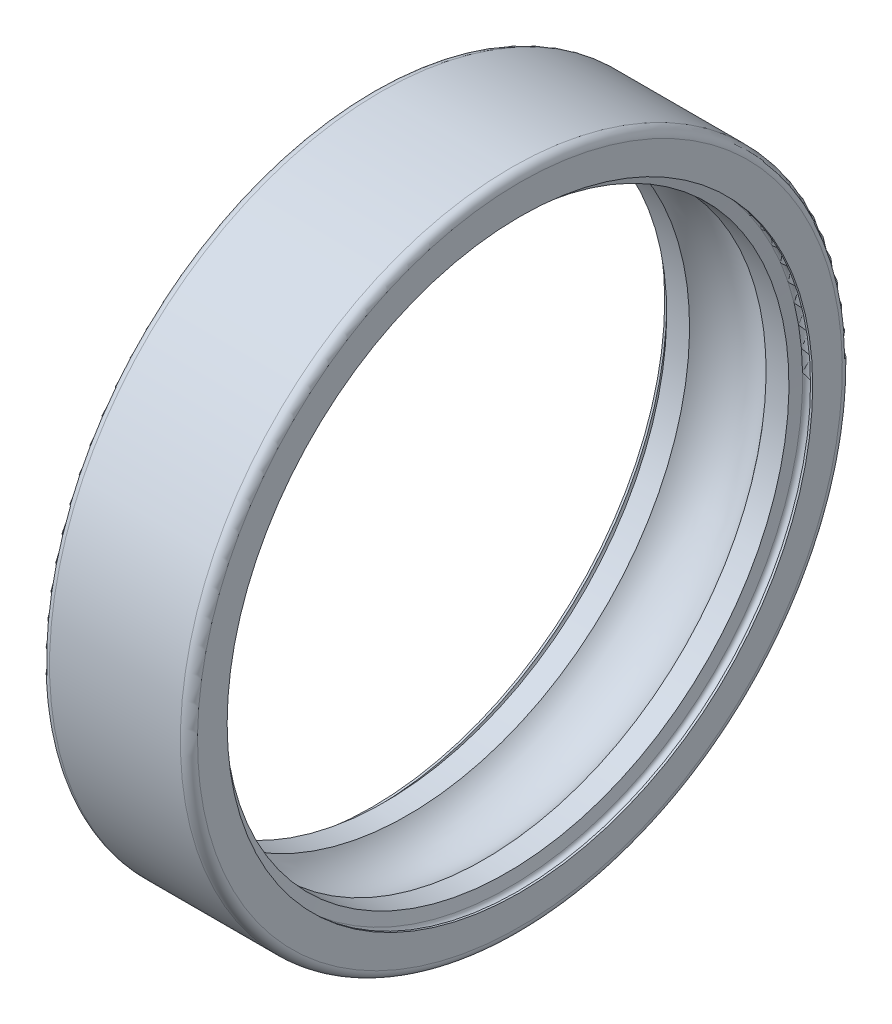
ISO-10303-21;
HEADER;
FILE_DESCRIPTION(('STEP AP214'),'2;1');
FILE_NAME('part.step','',(''),(''),'','','');
FILE_SCHEMA(('AUTOMOTIVE_DESIGN { 1 0 10303 214 1 1 1 1 }'));
ENDSEC;
DATA;
#1=APPLICATION_CONTEXT('core data for automotive mechanical design processes');
#2=APPLICATION_PROTOCOL_DEFINITION('international standard','automotive_design',2000,#1);
#3=PRODUCT_CONTEXT('',#1,'mechanical');
#4=PRODUCT('Part','Part','',(#3));
#5=PRODUCT_RELATED_PRODUCT_CATEGORY('part','',(#4));
#6=PRODUCT_DEFINITION_FORMATION('','',#4);
#7=PRODUCT_DEFINITION_CONTEXT('part definition',#1,'design');
#8=PRODUCT_DEFINITION('design','',#6,#7);
#9=PRODUCT_DEFINITION_SHAPE('','',#8);
#10=(LENGTH_UNIT() NAMED_UNIT(*) SI_UNIT(.MILLI.,.METRE.));
#11=(NAMED_UNIT(*) PLANE_ANGLE_UNIT() SI_UNIT($,.RADIAN.));
#12=(NAMED_UNIT(*) SI_UNIT($,.STERADIAN.) SOLID_ANGLE_UNIT());
#13=UNCERTAINTY_MEASURE_WITH_UNIT(LENGTH_MEASURE(1.E-05),#10,'distance_accuracy_value','');
#14=(GEOMETRIC_REPRESENTATION_CONTEXT(3) GLOBAL_UNCERTAINTY_ASSIGNED_CONTEXT((#13)) GLOBAL_UNIT_ASSIGNED_CONTEXT((#10,
#11,#12)) REPRESENTATION_CONTEXT('',''));
#15=CARTESIAN_POINT('',(0.,0.,0.));
#16=DIRECTION('',(0.,0.,1.));
#17=DIRECTION('',(1.,0.,0.));
#18=AXIS2_PLACEMENT_3D('',#15,#16,#17);
#19=CARTESIAN_POINT('',(18.163,0.,0.));
#20=DIRECTION('',(1.,0.,0.));
#21=DIRECTION('',(0.,0.,-1.));
#22=AXIS2_PLACEMENT_3D('',#19,#20,#21);
#23=TOROIDAL_SURFACE('',#22,37.595,0.558);
#24=CARTESIAN_POINT('',(18.721,0.,0.));
#25=DIRECTION('',(1.,0.,0.));
#26=DIRECTION('',(0.,1.,0.));
#27=AXIS2_PLACEMENT_3D('',#24,#25,#26);
#28=CIRCLE('',#27,37.595);
#29=CARTESIAN_POINT('',(18.721,37.595,0.));
#30=VERTEX_POINT('',#29);
#31=EDGE_CURVE('E11',#30,#30,#28,.T.);
#32=ORIENTED_EDGE('',*,*,#31,.T.);
#33=EDGE_LOOP('',(#32));
#34=FACE_BOUND('',#33,.T.);
#35=CARTESIAN_POINT('',(17.6134772738192,0.,0.));
#36=DIRECTION('',(1.,0.,0.));
#37=DIRECTION('',(0.,1.,0.));
#38=AXIS2_PLACEMENT_3D('',#35,#36,#37);
#39=CIRCLE('',#38,37.6918956831381);
#40=CARTESIAN_POINT('',(17.6134772738192,37.6918956831381,0.));
#41=VERTEX_POINT('',#40);
#42=EDGE_CURVE('E83',#41,#41,#39,.T.);
#43=ORIENTED_EDGE('',*,*,#42,.F.);
#44=EDGE_LOOP('',(#43));
#45=FACE_BOUND('',#44,.T.);
#46=ADVANCED_FACE('F17',(#34,#45),#23,.F.);
#47=CARTESIAN_POINT('',(18.8605,0.,0.));
#48=DIRECTION('',(-1.,0.,0.));
#49=DIRECTION('',(0.,1.,0.));
#50=AXIS2_PLACEMENT_3D('',#47,#48,#49);
#51=CYLINDRICAL_SURFACE('',#50,37.595);
#52=CARTESIAN_POINT('',(19.,0.,0.));
#53=DIRECTION('',(1.,0.,0.));
#54=DIRECTION('',(0.,1.,0.));
#55=AXIS2_PLACEMENT_3D('',#52,#53,#54);
#56=CIRCLE('',#55,37.595);
#57=CARTESIAN_POINT('',(19.,37.595,0.));
#58=VERTEX_POINT('',#57);
#59=EDGE_CURVE('E27',#58,#58,#56,.T.);
#60=ORIENTED_EDGE('',*,*,#59,.T.);
#61=EDGE_LOOP('',(#60));
#62=FACE_BOUND('',#61,.T.);
#63=ORIENTED_EDGE('',*,*,#31,.F.);
#64=EDGE_LOOP('',(#63));
#65=FACE_BOUND('',#64,.T.);
#66=ADVANCED_FACE('F112',(#62,#65),#51,.F.);
#67=CARTESIAN_POINT('',(19.,39.4975,0.));
#68=DIRECTION('',(1.,0.,0.));
#69=DIRECTION('',(0.,1.,0.));
#70=AXIS2_PLACEMENT_3D('',#67,#68,#69);
#71=PLANE('',#70);
#72=CARTESIAN_POINT('',(19.,0.,0.));
#73=DIRECTION('',(1.,0.,0.));
#74=DIRECTION('',(0.,1.,0.));
#75=AXIS2_PLACEMENT_3D('',#72,#73,#74);
#76=CIRCLE('',#75,41.4);
#77=CARTESIAN_POINT('',(19.,41.4,0.));
#78=VERTEX_POINT('',#77);
#79=EDGE_CURVE('E80',#78,#78,#76,.T.);
#80=ORIENTED_EDGE('',*,*,#79,.T.);
#81=EDGE_LOOP('',(#80));
#82=FACE_BOUND('',#81,.T.);
#83=ORIENTED_EDGE('',*,*,#59,.F.);
#84=EDGE_LOOP('',(#83));
#85=FACE_BOUND('',#84,.T.);
#86=ADVANCED_FACE('F19',(#82,#85),#71,.T.);
#87=CARTESIAN_POINT('',(17.9,0.,0.));
#88=DIRECTION('',(1.,0.,0.));
#89=DIRECTION('',(0.,0.,-1.));
#90=AXIS2_PLACEMENT_3D('',#87,#88,#89);
#91=TOROIDAL_SURFACE('',#90,41.4,1.1);
#92=CARTESIAN_POINT('',(17.9,0.,0.));
#93=DIRECTION('',(1.,0.,0.));
#94=DIRECTION('',(0.,1.,0.));
#95=AXIS2_PLACEMENT_3D('',#92,#93,#94);
#96=CIRCLE('',#95,42.5);
#97=CARTESIAN_POINT('',(17.9,42.5,0.));
#98=VERTEX_POINT('',#97);
#99=EDGE_CURVE('E85',#98,#98,#96,.T.);
#100=ORIENTED_EDGE('',*,*,#99,.T.);
#101=EDGE_LOOP('',(#100));
#102=FACE_BOUND('',#101,.T.);
#103=ORIENTED_EDGE('',*,*,#79,.F.);
#104=EDGE_LOOP('',(#103));
#105=FACE_BOUND('',#104,.T.);
#106=ADVANCED_FACE('F99',(#102,#105),#91,.T.);
#107=CARTESIAN_POINT('',(9.5,0.,0.));
#108=DIRECTION('',(-1.,0.,0.));
#109=DIRECTION('',(0.,1.,0.));
#110=AXIS2_PLACEMENT_3D('',#107,#108,#109);
#111=CYLINDRICAL_SURFACE('',#110,42.5);
#112=CARTESIAN_POINT('',(1.1,0.,0.));
#113=DIRECTION('',(1.,0.,0.));
#114=DIRECTION('',(0.,1.,0.));
#115=AXIS2_PLACEMENT_3D('',#112,#113,#114);
#116=CIRCLE('',#115,42.5);
#117=CARTESIAN_POINT('',(1.1,42.5,0.));
#118=VERTEX_POINT('',#117);
#119=EDGE_CURVE('E87',#118,#118,#116,.T.);
#120=ORIENTED_EDGE('',*,*,#119,.T.);
#121=EDGE_LOOP('',(#120));
#122=FACE_BOUND('',#121,.T.);
#123=ORIENTED_EDGE('',*,*,#99,.F.);
#124=EDGE_LOOP('',(#123));
#125=FACE_BOUND('',#124,.T.);
#126=ADVANCED_FACE('F101',(#122,#125),#111,.T.);
#127=CARTESIAN_POINT('',(1.1,0.,0.));
#128=DIRECTION('',(1.,0.,0.));
#129=DIRECTION('',(0.,0.,-1.));
#130=AXIS2_PLACEMENT_3D('',#127,#128,#129);
#131=TOROIDAL_SURFACE('',#130,41.4,1.1);
#132=CARTESIAN_POINT('',(0.,0.,0.));
#133=DIRECTION('',(1.,0.,0.));
#134=DIRECTION('',(0.,1.,0.));
#135=AXIS2_PLACEMENT_3D('',#132,#133,#134);
#136=CIRCLE('',#135,41.4);
#137=CARTESIAN_POINT('',(0.,41.4,0.));
#138=VERTEX_POINT('',#137);
#139=EDGE_CURVE('E21',#138,#138,#136,.T.);
#140=ORIENTED_EDGE('',*,*,#139,.T.);
#141=EDGE_LOOP('',(#140));
#142=FACE_BOUND('',#141,.T.);
#143=ORIENTED_EDGE('',*,*,#119,.F.);
#144=EDGE_LOOP('',(#143));
#145=FACE_BOUND('',#144,.T.);
#146=ADVANCED_FACE('F109',(#142,#145),#131,.T.);
#147=CARTESIAN_POINT('',(0.,39.4975,0.));
#148=DIRECTION('',(-1.,0.,0.));
#149=DIRECTION('',(0.,-1.,0.));
#150=AXIS2_PLACEMENT_3D('',#147,#148,#149);
#151=PLANE('',#150);
#152=CARTESIAN_POINT('',(0.,0.,0.));
#153=DIRECTION('',(1.,0.,0.));
#154=DIRECTION('',(0.,1.,0.));
#155=AXIS2_PLACEMENT_3D('',#152,#153,#154);
#156=CIRCLE('',#155,37.595);
#157=CARTESIAN_POINT('',(0.,37.595,0.));
#158=VERTEX_POINT('',#157);
#159=EDGE_CURVE('E74',#158,#158,#156,.T.);
#160=ORIENTED_EDGE('',*,*,#159,.T.);
#161=EDGE_LOOP('',(#160));
#162=FACE_BOUND('',#161,.T.);
#163=ORIENTED_EDGE('',*,*,#139,.F.);
#164=EDGE_LOOP('',(#163));
#165=FACE_BOUND('',#164,.T.);
#166=ADVANCED_FACE('F139',(#162,#165),#151,.T.);
#167=CARTESIAN_POINT('',(0.139499999999998,0.,0.));
#168=DIRECTION('',(-1.,0.,0.));
#169=DIRECTION('',(0.,1.,0.));
#170=AXIS2_PLACEMENT_3D('',#167,#168,#169);
#171=CYLINDRICAL_SURFACE('',#170,37.595);
#172=CARTESIAN_POINT('',(0.279,0.,0.));
#173=DIRECTION('',(1.,0.,0.));
#174=DIRECTION('',(0.,1.,0.));
#175=AXIS2_PLACEMENT_3D('',#172,#173,#174);
#176=CIRCLE('',#175,37.595);
#177=CARTESIAN_POINT('',(0.279,37.595,0.));
#178=VERTEX_POINT('',#177);
#179=EDGE_CURVE('E72',#178,#178,#176,.T.);
#180=ORIENTED_EDGE('',*,*,#179,.T.);
#181=EDGE_LOOP('',(#180));
#182=FACE_BOUND('',#181,.T.);
#183=ORIENTED_EDGE('',*,*,#159,.F.);
#184=EDGE_LOOP('',(#183));
#185=FACE_BOUND('',#184,.T.);
#186=ADVANCED_FACE('F134',(#182,#185),#171,.F.);
#187=CARTESIAN_POINT('',(0.837,0.,0.));
#188=DIRECTION('',(1.,0.,0.));
#189=DIRECTION('',(0.,0.,-1.));
#190=AXIS2_PLACEMENT_3D('',#187,#188,#189);
#191=TOROIDAL_SURFACE('',#190,37.595,0.558);
#192=CARTESIAN_POINT('',(1.38652272618081,0.,0.));
#193=DIRECTION('',(1.,0.,0.));
#194=DIRECTION('',(0.,1.,0.));
#195=AXIS2_PLACEMENT_3D('',#192,#193,#194);
#196=CIRCLE('',#195,37.6918956831381);
#197=CARTESIAN_POINT('',(1.38652272618081,37.6918956831381,0.));
#198=VERTEX_POINT('',#197);
#199=EDGE_CURVE('E68',#198,#198,#196,.T.);
#200=ORIENTED_EDGE('',*,*,#199,.T.);
#201=EDGE_LOOP('',(#200));
#202=FACE_BOUND('',#201,.T.);
#203=ORIENTED_EDGE('',*,*,#179,.F.);
#204=EDGE_LOOP('',(#203));
#205=FACE_BOUND('',#204,.T.);
#206=ADVANCED_FACE('F69',(#202,#205),#191,.F.);
#207=CARTESIAN_POINT('',(1.51805345685067,0.,0.));
#208=DIRECTION('',(-1.,0.,0.));
#209=DIRECTION('',(0.,1.,0.));
#210=AXIS2_PLACEMENT_3D('',#207,#208,#209);
#211=CONICAL_SURFACE('',#210,36.945947841569,1.39626340159546);
#212=CARTESIAN_POINT('',(1.64958418752055,0.,0.));
#213=DIRECTION('',(1.,0.,0.));
#214=DIRECTION('',(0.,1.,0.));
#215=AXIS2_PLACEMENT_3D('',#212,#213,#214);
#216=CIRCLE('',#215,36.2);
#217=CARTESIAN_POINT('',(1.64958418752055,36.2,0.));
#218=VERTEX_POINT('',#217);
#219=EDGE_CURVE('E64',#218,#218,#216,.T.);
#220=ORIENTED_EDGE('',*,*,#219,.T.);
#221=EDGE_LOOP('',(#220));
#222=FACE_BOUND('',#221,.T.);
#223=ORIENTED_EDGE('',*,*,#199,.F.);
#224=EDGE_LOOP('',(#223));
#225=FACE_BOUND('',#224,.T.);
#226=ADVANCED_FACE('F125',(#222,#225),#211,.F.);
#227=CARTESIAN_POINT('',(3.11761117602141,0.,0.));
#228=DIRECTION('',(-1.,0.,0.));
#229=DIRECTION('',(0.,1.,0.));
#230=AXIS2_PLACEMENT_3D('',#227,#228,#229);
#231=CYLINDRICAL_SURFACE('',#230,36.2);
#232=CARTESIAN_POINT('',(4.58563816452229,0.,0.));
#233=DIRECTION('',(1.,0.,0.));
#234=DIRECTION('',(0.,1.,0.));
#235=AXIS2_PLACEMENT_3D('',#232,#233,#234);
#236=CIRCLE('',#235,36.2);
#237=CARTESIAN_POINT('',(4.58563816452229,36.2,0.));
#238=VERTEX_POINT('',#237);
#239=EDGE_CURVE('E76',#238,#238,#236,.T.);
#240=ORIENTED_EDGE('',*,*,#239,.T.);
#241=EDGE_LOOP('',(#240));
#242=FACE_BOUND('',#241,.T.);
#243=ORIENTED_EDGE('',*,*,#219,.F.);
#244=EDGE_LOOP('',(#243));
#245=FACE_BOUND('',#244,.T.);
#246=ADVANCED_FACE('F127',(#242,#245),#231,.F.);
#247=CARTESIAN_POINT('',(9.5,0.,0.));
#248=DIRECTION('',(1.,0.,0.));
#249=DIRECTION('',(0.,0.,-1.));
#250=AXIS2_PLACEMENT_3D('',#247,#248,#249);
#251=TOROIDAL_SURFACE('',#250,32.5,6.1515);
#252=CARTESIAN_POINT('',(14.4143618354777,0.,0.));
#253=DIRECTION('',(1.,0.,0.));
#254=DIRECTION('',(0.,1.,0.));
#255=AXIS2_PLACEMENT_3D('',#252,#253,#254);
#256=CIRCLE('',#255,36.2);
#257=CARTESIAN_POINT('',(14.4143618354777,36.2,0.));
#258=VERTEX_POINT('',#257);
#259=EDGE_CURVE('E82',#258,#258,#256,.T.);
#260=ORIENTED_EDGE('',*,*,#259,.T.);
#261=EDGE_LOOP('',(#260));
#262=FACE_BOUND('',#261,.T.);
#263=ORIENTED_EDGE('',*,*,#239,.F.);
#264=EDGE_LOOP('',(#263));
#265=FACE_BOUND('',#264,.T.);
#266=ADVANCED_FACE('F132',(#262,#265),#251,.F.);
#267=CARTESIAN_POINT('',(15.8823888239786,0.,0.));
#268=DIRECTION('',(-1.,0.,0.));
#269=DIRECTION('',(0.,1.,0.));
#270=AXIS2_PLACEMENT_3D('',#267,#268,#269);
#271=CYLINDRICAL_SURFACE('',#270,36.2);
#272=CARTESIAN_POINT('',(17.3504158124795,0.,0.));
#273=DIRECTION('',(1.,0.,0.));
#274=DIRECTION('',(0.,1.,0.));
#275=AXIS2_PLACEMENT_3D('',#272,#273,#274);
#276=CIRCLE('',#275,36.2);
#277=CARTESIAN_POINT('',(17.3504158124795,36.2,0.));
#278=VERTEX_POINT('',#277);
#279=EDGE_CURVE('E89',#278,#278,#276,.T.);
#280=ORIENTED_EDGE('',*,*,#279,.T.);
#281=EDGE_LOOP('',(#280));
#282=FACE_BOUND('',#281,.T.);
#283=ORIENTED_EDGE('',*,*,#259,.F.);
#284=EDGE_LOOP('',(#283));
#285=FACE_BOUND('',#284,.T.);
#286=ADVANCED_FACE('F124',(#282,#285),#271,.F.);
#287=CARTESIAN_POINT('',(17.4819465431493,0.,0.));
#288=DIRECTION('',(1.,0.,0.));
#289=DIRECTION('',(0.,1.,0.));
#290=AXIS2_PLACEMENT_3D('',#287,#288,#289);
#291=CONICAL_SURFACE('',#290,36.945947841569,1.39626340159546);
#292=ORIENTED_EDGE('',*,*,#42,.T.);
#293=EDGE_LOOP('',(#292));
#294=FACE_BOUND('',#293,.T.);
#295=ORIENTED_EDGE('',*,*,#279,.F.);
#296=EDGE_LOOP('',(#295));
#297=FACE_BOUND('',#296,.T.);
#298=ADVANCED_FACE('F143',(#294,#297),#291,.F.);
#299=CLOSED_SHELL('',(#46,#66,#86,#106,#126,#146,#166,#186,#206,#226,#246,#266,#286,#298));
#300=MANIFOLD_SOLID_BREP('B1',#299);
#301=ADVANCED_BREP_SHAPE_REPRESENTATION('',(#18,#300),#14);
#302=SHAPE_DEFINITION_REPRESENTATION(#9,#301);
ENDSEC;
END-ISO-10303-21;
